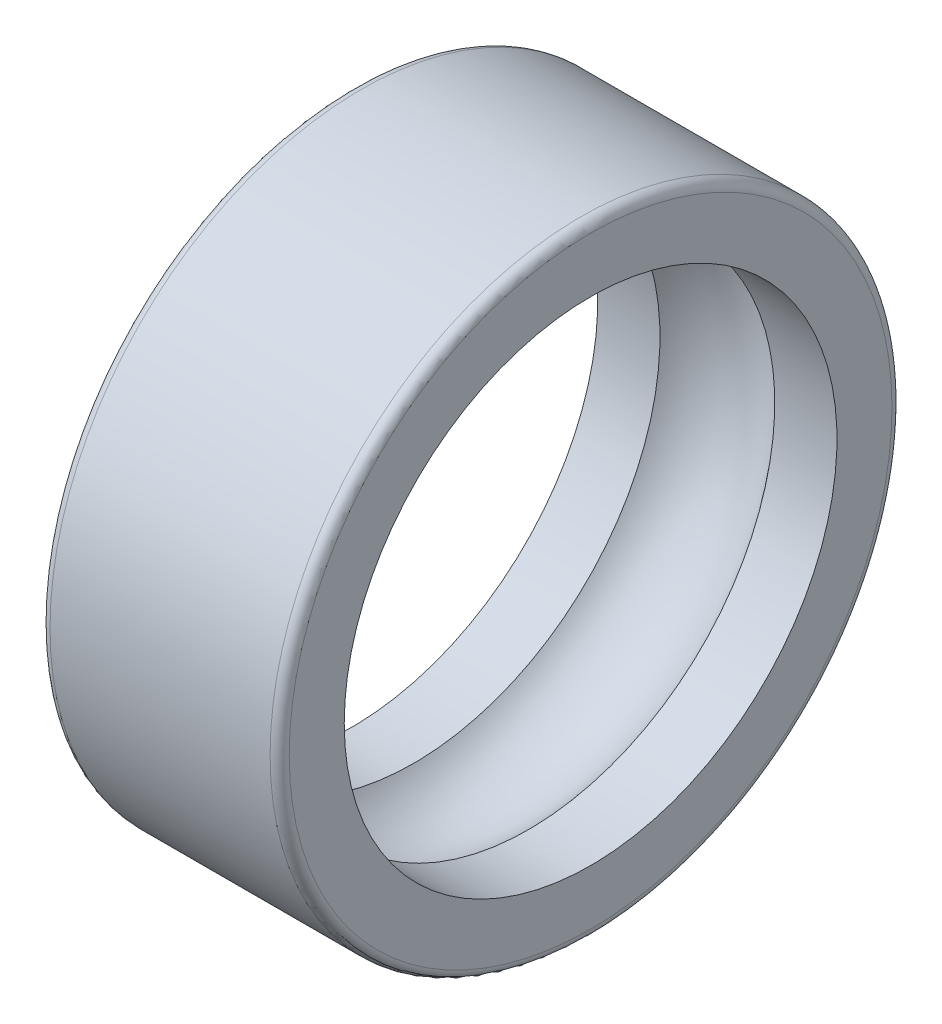
ISO-10303-21;
HEADER;
FILE_DESCRIPTION(('STEP AP214'),'2;1');
FILE_NAME('part.step','',(''),(''),'','','');
FILE_SCHEMA(('AUTOMOTIVE_DESIGN { 1 0 10303 214 1 1 1 1 }'));
ENDSEC;
DATA;
#1=APPLICATION_CONTEXT('core data for automotive mechanical design processes');
#2=APPLICATION_PROTOCOL_DEFINITION('international standard','automotive_design',2000,#1);
#3=PRODUCT_CONTEXT('',#1,'mechanical');
#4=PRODUCT('Part','Part','',(#3));
#5=PRODUCT_RELATED_PRODUCT_CATEGORY('part','',(#4));
#6=PRODUCT_DEFINITION_FORMATION('','',#4);
#7=PRODUCT_DEFINITION_CONTEXT('part definition',#1,'design');
#8=PRODUCT_DEFINITION('design','',#6,#7);
#9=PRODUCT_DEFINITION_SHAPE('','',#8);
#10=(LENGTH_UNIT() NAMED_UNIT(*) SI_UNIT(.MILLI.,.METRE.));
#11=(NAMED_UNIT(*) PLANE_ANGLE_UNIT() SI_UNIT($,.RADIAN.));
#12=(NAMED_UNIT(*) SI_UNIT($,.STERADIAN.) SOLID_ANGLE_UNIT());
#13=UNCERTAINTY_MEASURE_WITH_UNIT(LENGTH_MEASURE(1.E-05),#10,'distance_accuracy_value','');
#14=(GEOMETRIC_REPRESENTATION_CONTEXT(3) GLOBAL_UNCERTAINTY_ASSIGNED_CONTEXT((#13)) GLOBAL_UNIT_ASSIGNED_CONTEXT((#10,
#11,#12)) REPRESENTATION_CONTEXT('',''));
#15=CARTESIAN_POINT('',(0.,0.,0.));
#16=DIRECTION('',(0.,0.,1.));
#17=DIRECTION('',(1.,0.,0.));
#18=AXIS2_PLACEMENT_3D('',#15,#16,#17);
#19=CARTESIAN_POINT('',(0.,6.3,0.));
#20=DIRECTION('',(1.,0.,0.));
#21=DIRECTION('',(0.,0.,-1.));
#22=AXIS2_PLACEMENT_3D('',#19,#20,#21);
#23=PLANE('',#22);
#24=CARTESIAN_POINT('',(0.,0.,0.));
#25=DIRECTION('',(-1.,0.,0.));
#26=DIRECTION('',(0.,0.,1.));
#27=AXIS2_PLACEMENT_3D('',#24,#25,#26);
#28=CIRCLE('',#27,5.15);
#29=CARTESIAN_POINT('',(0.,0.,5.15));
#30=VERTEX_POINT('',#29);
#31=EDGE_CURVE('E10',#30,#30,#28,.T.);
#32=ORIENTED_EDGE('',*,*,#31,.F.);
#33=EDGE_LOOP('',(#32));
#34=FACE_BOUND('',#33,.T.);
#35=CARTESIAN_POINT('',(0.,0.,0.));
#36=DIRECTION('',(-1.,0.,0.));
#37=DIRECTION('',(0.,0.,1.));
#38=AXIS2_PLACEMENT_3D('',#35,#36,#37);
#39=CIRCLE('',#38,6.3);
#40=CARTESIAN_POINT('',(0.,0.,6.3));
#41=VERTEX_POINT('',#40);
#42=EDGE_CURVE('E56',#41,#41,#39,.T.);
#43=ORIENTED_EDGE('',*,*,#42,.T.);
#44=EDGE_LOOP('',(#43));
#45=FACE_BOUND('',#44,.T.);
#46=ADVANCED_FACE('F14',(#34,#45),#23,.F.);
#47=CARTESIAN_POINT('',(0.,0.,0.));
#48=DIRECTION('',(-1.,0.,0.));
#49=DIRECTION('',(0.,0.,1.));
#50=AXIS2_PLACEMENT_3D('',#47,#48,#49);
#51=CYLINDRICAL_SURFACE('',#50,5.15);
#52=CARTESIAN_POINT('',(1.3,0.,0.));
#53=DIRECTION('',(-1.,0.,0.));
#54=DIRECTION('',(0.,0.,1.));
#55=AXIS2_PLACEMENT_3D('',#52,#53,#54);
#56=CIRCLE('',#55,5.15);
#57=CARTESIAN_POINT('',(1.3,0.,5.15));
#58=VERTEX_POINT('',#57);
#59=EDGE_CURVE('E21',#58,#58,#56,.T.);
#60=ORIENTED_EDGE('',*,*,#59,.F.);
#61=EDGE_LOOP('',(#60));
#62=FACE_BOUND('',#61,.T.);
#63=ORIENTED_EDGE('',*,*,#31,.T.);
#64=EDGE_LOOP('',(#63));
#65=FACE_BOUND('',#64,.T.);
#66=ADVANCED_FACE('F94',(#62,#65),#51,.F.);
#67=CARTESIAN_POINT('',(2.5,0.,0.));
#68=DIRECTION('',(-1.,0.,0.));
#69=DIRECTION('',(0.,0.,1.));
#70=AXIS2_PLACEMENT_3D('',#67,#68,#69);
#71=TOROIDAL_SURFACE('',#70,4.25,1.5);
#72=ORIENTED_EDGE('',*,*,#59,.T.);
#73=EDGE_LOOP('',(#72));
#74=FACE_BOUND('',#73,.T.);
#75=CARTESIAN_POINT('',(3.7,0.,0.));
#76=DIRECTION('',(-1.,0.,0.));
#77=DIRECTION('',(0.,0.,1.));
#78=AXIS2_PLACEMENT_3D('',#75,#76,#77);
#79=CIRCLE('',#78,5.15);
#80=CARTESIAN_POINT('',(3.7,0.,5.15));
#81=VERTEX_POINT('',#80);
#82=EDGE_CURVE('E30',#81,#81,#79,.T.);
#83=ORIENTED_EDGE('',*,*,#82,.F.);
#84=EDGE_LOOP('',(#83));
#85=FACE_BOUND('',#84,.T.);
#86=ADVANCED_FACE('F89',(#74,#85),#71,.F.);
#87=CARTESIAN_POINT('',(0.,0.,0.));
#88=DIRECTION('',(-1.,0.,0.));
#89=DIRECTION('',(0.,0.,1.));
#90=AXIS2_PLACEMENT_3D('',#87,#88,#89);
#91=CYLINDRICAL_SURFACE('',#90,5.15);
#92=CARTESIAN_POINT('',(5.,0.,0.));
#93=DIRECTION('',(-1.,0.,0.));
#94=DIRECTION('',(0.,0.,1.));
#95=AXIS2_PLACEMENT_3D('',#92,#93,#94);
#96=CIRCLE('',#95,5.15);
#97=CARTESIAN_POINT('',(5.,0.,5.15));
#98=VERTEX_POINT('',#97);
#99=EDGE_CURVE('E38',#98,#98,#96,.T.);
#100=ORIENTED_EDGE('',*,*,#99,.F.);
#101=EDGE_LOOP('',(#100));
#102=FACE_BOUND('',#101,.T.);
#103=ORIENTED_EDGE('',*,*,#82,.T.);
#104=EDGE_LOOP('',(#103));
#105=FACE_BOUND('',#104,.T.);
#106=ADVANCED_FACE('F83',(#102,#105),#91,.F.);
#107=CARTESIAN_POINT('',(5.,5.15,0.));
#108=DIRECTION('',(-1.,0.,0.));
#109=DIRECTION('',(0.,0.,1.));
#110=AXIS2_PLACEMENT_3D('',#107,#108,#109);
#111=PLANE('',#110);
#112=CARTESIAN_POINT('',(5.,0.,0.));
#113=DIRECTION('',(-1.,0.,0.));
#114=DIRECTION('',(0.,0.,1.));
#115=AXIS2_PLACEMENT_3D('',#112,#113,#114);
#116=CIRCLE('',#115,6.3);
#117=CARTESIAN_POINT('',(5.,0.,6.3));
#118=VERTEX_POINT('',#117);
#119=EDGE_CURVE('E44',#118,#118,#116,.T.);
#120=ORIENTED_EDGE('',*,*,#119,.F.);
#121=EDGE_LOOP('',(#120));
#122=FACE_BOUND('',#121,.T.);
#123=ORIENTED_EDGE('',*,*,#99,.T.);
#124=EDGE_LOOP('',(#123));
#125=FACE_BOUND('',#124,.T.);
#126=ADVANCED_FACE('F77',(#122,#125),#111,.F.);
#127=CARTESIAN_POINT('',(4.8,0.,0.));
#128=DIRECTION('',(-1.,0.,0.));
#129=DIRECTION('',(0.,0.,1.));
#130=AXIS2_PLACEMENT_3D('',#127,#128,#129);
#131=TOROIDAL_SURFACE('',#130,6.3,0.2);
#132=CARTESIAN_POINT('',(4.8,0.,0.));
#133=DIRECTION('',(-1.,0.,0.));
#134=DIRECTION('',(0.,0.,1.));
#135=AXIS2_PLACEMENT_3D('',#132,#133,#134);
#136=CIRCLE('',#135,6.5);
#137=CARTESIAN_POINT('',(4.8,0.,6.5));
#138=VERTEX_POINT('',#137);
#139=EDGE_CURVE('E48',#138,#138,#136,.T.);
#140=ORIENTED_EDGE('',*,*,#139,.F.);
#141=EDGE_LOOP('',(#140));
#142=FACE_BOUND('',#141,.T.);
#143=ORIENTED_EDGE('',*,*,#119,.T.);
#144=EDGE_LOOP('',(#143));
#145=FACE_BOUND('',#144,.T.);
#146=ADVANCED_FACE('F71',(#142,#145),#131,.T.);
#147=CARTESIAN_POINT('',(0.,0.,0.));
#148=DIRECTION('',(-1.,0.,0.));
#149=DIRECTION('',(0.,0.,1.));
#150=AXIS2_PLACEMENT_3D('',#147,#148,#149);
#151=CYLINDRICAL_SURFACE('',#150,6.5);
#152=CARTESIAN_POINT('',(0.2,0.,0.));
#153=DIRECTION('',(-1.,0.,0.));
#154=DIRECTION('',(0.,0.,1.));
#155=AXIS2_PLACEMENT_3D('',#152,#153,#154);
#156=CIRCLE('',#155,6.5);
#157=CARTESIAN_POINT('',(0.2,0.,6.5));
#158=VERTEX_POINT('',#157);
#159=EDGE_CURVE('E52',#158,#158,#156,.T.);
#160=ORIENTED_EDGE('',*,*,#159,.F.);
#161=EDGE_LOOP('',(#160));
#162=FACE_BOUND('',#161,.T.);
#163=ORIENTED_EDGE('',*,*,#139,.T.);
#164=EDGE_LOOP('',(#163));
#165=FACE_BOUND('',#164,.T.);
#166=ADVANCED_FACE('F65',(#162,#165),#151,.T.);
#167=CARTESIAN_POINT('',(0.2,0.,0.));
#168=DIRECTION('',(-1.,0.,0.));
#169=DIRECTION('',(0.,0.,1.));
#170=AXIS2_PLACEMENT_3D('',#167,#168,#169);
#171=TOROIDAL_SURFACE('',#170,6.3,0.2);
#172=ORIENTED_EDGE('',*,*,#42,.F.);
#173=EDGE_LOOP('',(#172));
#174=FACE_BOUND('',#173,.T.);
#175=ORIENTED_EDGE('',*,*,#159,.T.);
#176=EDGE_LOOP('',(#175));
#177=FACE_BOUND('',#176,.T.);
#178=ADVANCED_FACE('F62',(#174,#177),#171,.T.);
#179=CLOSED_SHELL('',(#46,#66,#86,#106,#126,#146,#166,#178));
#180=MANIFOLD_SOLID_BREP('B1',#179);
#181=ADVANCED_BREP_SHAPE_REPRESENTATION('',(#18,#180),#14);
#182=SHAPE_DEFINITION_REPRESENTATION(#9,#181);
ENDSEC;
END-ISO-10303-21;
